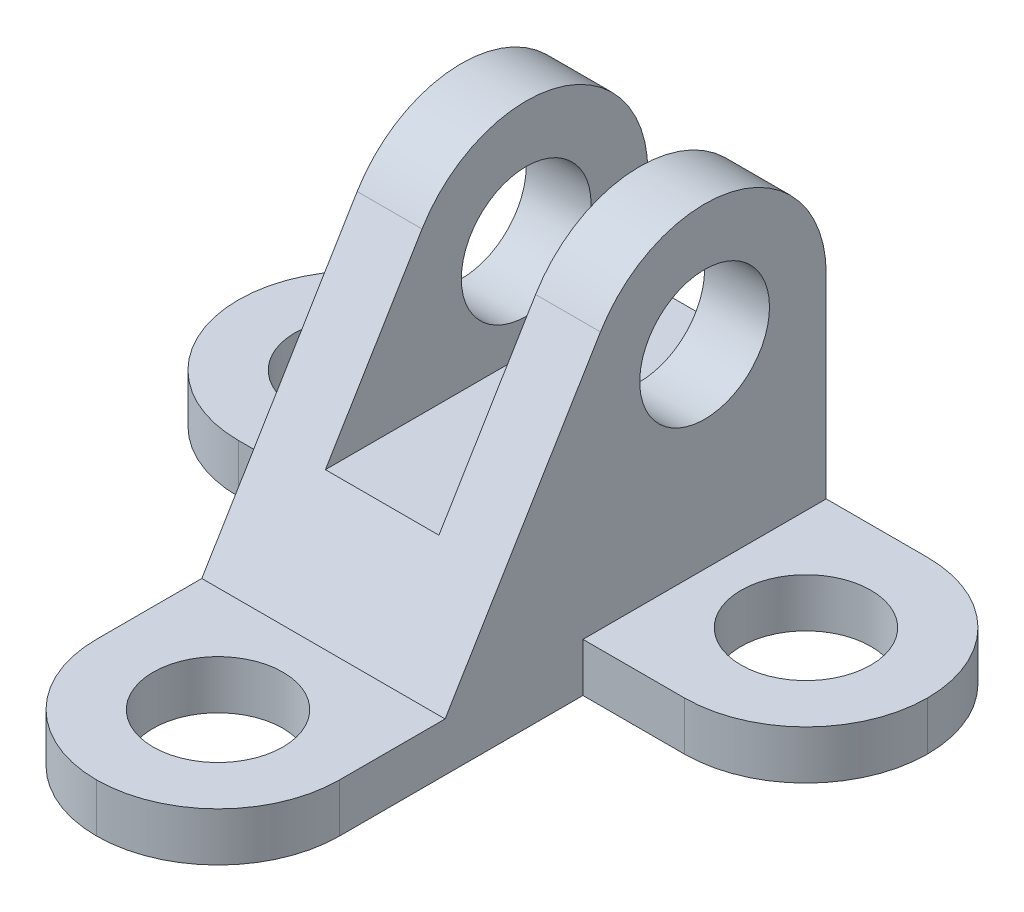
ISO-10303-21;
HEADER;
FILE_DESCRIPTION(('STEP AP214'),'2;1');
FILE_NAME('part.step','',(''),(''),'','','');
FILE_SCHEMA(('AUTOMOTIVE_DESIGN { 1 0 10303 214 1 1 1 1 }'));
ENDSEC;
DATA;
#1=APPLICATION_CONTEXT('core data for automotive mechanical design processes');
#2=APPLICATION_PROTOCOL_DEFINITION('international standard','automotive_design',2000,#1);
#3=PRODUCT_CONTEXT('',#1,'mechanical');
#4=PRODUCT('Part','Part','',(#3));
#5=PRODUCT_RELATED_PRODUCT_CATEGORY('part','',(#4));
#6=PRODUCT_DEFINITION_FORMATION('','',#4);
#7=PRODUCT_DEFINITION_CONTEXT('part definition',#1,'design');
#8=PRODUCT_DEFINITION('design','',#6,#7);
#9=PRODUCT_DEFINITION_SHAPE('','',#8);
#10=(LENGTH_UNIT() NAMED_UNIT(*) SI_UNIT(.MILLI.,.METRE.));
#11=(NAMED_UNIT(*) PLANE_ANGLE_UNIT() SI_UNIT($,.RADIAN.));
#12=(NAMED_UNIT(*) SI_UNIT($,.STERADIAN.) SOLID_ANGLE_UNIT());
#13=UNCERTAINTY_MEASURE_WITH_UNIT(LENGTH_MEASURE(1.E-05),#10,'distance_accuracy_value','');
#14=(GEOMETRIC_REPRESENTATION_CONTEXT(3) GLOBAL_UNCERTAINTY_ASSIGNED_CONTEXT((#13)) GLOBAL_UNIT_ASSIGNED_CONTEXT((#10,
#11,#12)) REPRESENTATION_CONTEXT('',''));
#15=CARTESIAN_POINT('',(0.,0.,0.));
#16=DIRECTION('',(0.,0.,1.));
#17=DIRECTION('',(1.,0.,0.));
#18=AXIS2_PLACEMENT_3D('',#15,#16,#17);
#19=CARTESIAN_POINT('',(0.,0.,0.));
#20=DIRECTION('',(0.,1.,0.));
#21=DIRECTION('',(0.,0.,1.));
#22=AXIS2_PLACEMENT_3D('',#19,#20,#21);
#23=PLANE('',#22);
#24=CARTESIAN_POINT('',(15.,0.,-15.));
#25=DIRECTION('',(0.,-1.,0.));
#26=DIRECTION('',(0.,0.,-1.));
#27=AXIS2_PLACEMENT_3D('',#24,#25,#26);
#28=CIRCLE('',#27,7.99999999999999);
#29=CARTESIAN_POINT('',(15.,0.,-23.));
#30=VERTEX_POINT('',#29);
#31=EDGE_CURVE('E543',#30,#30,#28,.T.);
#32=ORIENTED_EDGE('',*,*,#31,.F.);
#33=EDGE_LOOP('',(#32));
#34=FACE_BOUND('',#33,.T.);
#35=DIRECTION('',(1.,0.,0.));
#36=VECTOR('',#35,1.);
#37=CARTESIAN_POINT('',(0.,0.,-30.));
#38=LINE('',#37,#36);
#39=CARTESIAN_POINT('',(15.,0.,-30.));
#40=VERTEX_POINT('',#39);
#41=CARTESIAN_POINT('',(70.,0.,-30.));
#42=VERTEX_POINT('',#41);
#43=EDGE_CURVE('E301',#40,#42,#38,.T.);
#44=ORIENTED_EDGE('',*,*,#43,.T.);
#45=CARTESIAN_POINT('',(70.,0.,-15.));
#46=DIRECTION('',(0.,1.,0.));
#47=DIRECTION('',(0.,0.,1.));
#48=AXIS2_PLACEMENT_3D('',#45,#46,#47);
#49=CIRCLE('',#48,15.);
#50=CARTESIAN_POINT('',(85.,0.,-15.));
#51=VERTEX_POINT('',#50);
#52=EDGE_CURVE('E340',#42,#51,#49,.F.);
#53=ORIENTED_EDGE('',*,*,#52,.T.);
#54=CARTESIAN_POINT('',(70.,0.,-15.));
#55=DIRECTION('',(0.,1.,0.));
#56=DIRECTION('',(0.,0.,1.));
#57=AXIS2_PLACEMENT_3D('',#54,#55,#56);
#58=CIRCLE('',#57,15.);
#59=CARTESIAN_POINT('',(70.,0.,0.));
#60=VERTEX_POINT('',#59);
#61=EDGE_CURVE('E337',#51,#60,#58,.F.);
#62=ORIENTED_EDGE('',*,*,#61,.T.);
#63=DIRECTION('',(1.,0.,0.));
#64=VECTOR('',#63,1.);
#65=CARTESIAN_POINT('',(0.,0.,0.));
#66=LINE('',#65,#64);
#67=CARTESIAN_POINT('',(57.5,0.,0.));
#68=VERTEX_POINT('',#67);
#69=EDGE_CURVE('E296',#68,#60,#66,.T.);
#70=ORIENTED_EDGE('',*,*,#69,.F.);
#71=DIRECTION('',(0.,0.,1.));
#72=VECTOR('',#71,1.);
#73=CARTESIAN_POINT('',(57.5,0.,0.));
#74=LINE('',#73,#72);
#75=CARTESIAN_POINT('',(57.5,0.,30.));
#76=VERTEX_POINT('',#75);
#77=EDGE_CURVE('E292',#68,#76,#74,.T.);
#78=ORIENTED_EDGE('',*,*,#77,.T.);
#79=CARTESIAN_POINT('',(42.5,0.,30.));
#80=DIRECTION('',(0.,1.,0.));
#81=DIRECTION('',(0.,0.,1.));
#82=AXIS2_PLACEMENT_3D('',#79,#80,#81);
#83=CIRCLE('',#82,15.);
#84=CARTESIAN_POINT('',(42.5,0.,45.));
#85=VERTEX_POINT('',#84);
#86=EDGE_CURVE('E325',#76,#85,#83,.F.);
#87=ORIENTED_EDGE('',*,*,#86,.T.);
#88=CARTESIAN_POINT('',(42.5,0.,30.));
#89=DIRECTION('',(0.,1.,0.));
#90=DIRECTION('',(0.,0.,1.));
#91=AXIS2_PLACEMENT_3D('',#88,#89,#90);
#92=CIRCLE('',#91,15.);
#93=CARTESIAN_POINT('',(27.5,0.,30.));
#94=VERTEX_POINT('',#93);
#95=EDGE_CURVE('E328',#85,#94,#92,.F.);
#96=ORIENTED_EDGE('',*,*,#95,.T.);
#97=DIRECTION('',(0.,0.,1.));
#98=VECTOR('',#97,1.);
#99=CARTESIAN_POINT('',(27.5,0.,0.));
#100=LINE('',#99,#98);
#101=CARTESIAN_POINT('',(27.5,0.,0.));
#102=VERTEX_POINT('',#101);
#103=EDGE_CURVE('E275',#102,#94,#100,.T.);
#104=ORIENTED_EDGE('',*,*,#103,.F.);
#105=DIRECTION('',(1.,0.,0.));
#106=VECTOR('',#105,1.);
#107=CARTESIAN_POINT('',(0.,0.,0.));
#108=LINE('',#107,#106);
#109=CARTESIAN_POINT('',(15.,0.,0.));
#110=VERTEX_POINT('',#109);
#111=EDGE_CURVE('E305',#110,#102,#108,.T.);
#112=ORIENTED_EDGE('',*,*,#111,.F.);
#113=CARTESIAN_POINT('',(15.,0.,-15.));
#114=DIRECTION('',(0.,1.,0.));
#115=DIRECTION('',(0.,0.,1.));
#116=AXIS2_PLACEMENT_3D('',#113,#114,#115);
#117=CIRCLE('',#116,15.);
#118=CARTESIAN_POINT('',(0.,0.,-15.));
#119=VERTEX_POINT('',#118);
#120=EDGE_CURVE('E331',#110,#119,#117,.F.);
#121=ORIENTED_EDGE('',*,*,#120,.T.);
#122=CARTESIAN_POINT('',(15.,0.,-15.));
#123=DIRECTION('',(0.,1.,0.));
#124=DIRECTION('',(0.,0.,1.));
#125=AXIS2_PLACEMENT_3D('',#122,#123,#124);
#126=CIRCLE('',#125,15.);
#127=EDGE_CURVE('E334',#119,#40,#126,.F.);
#128=ORIENTED_EDGE('',*,*,#127,.T.);
#129=EDGE_LOOP('',(#44,#53,#62,#70,#78,#87,#96,#104,#112,#121,#128));
#130=FACE_BOUND('',#129,.T.);
#131=CARTESIAN_POINT('',(42.5,0.,30.));
#132=DIRECTION('',(0.,-1.,0.));
#133=DIRECTION('',(0.,0.,-1.));
#134=AXIS2_PLACEMENT_3D('',#131,#132,#133);
#135=CIRCLE('',#134,7.99999999999999);
#136=CARTESIAN_POINT('',(42.5,0.,22.));
#137=VERTEX_POINT('',#136);
#138=EDGE_CURVE('E526',#137,#137,#135,.T.);
#139=ORIENTED_EDGE('',*,*,#138,.F.);
#140=EDGE_LOOP('',(#139));
#141=FACE_BOUND('',#140,.T.);
#142=CARTESIAN_POINT('',(70.,0.,-15.));
#143=DIRECTION('',(0.,-1.,0.));
#144=DIRECTION('',(0.,0.,-1.));
#145=AXIS2_PLACEMENT_3D('',#142,#143,#144);
#146=CIRCLE('',#145,7.99999999999999);
#147=CARTESIAN_POINT('',(70.,0.,-23.));
#148=VERTEX_POINT('',#147);
#149=EDGE_CURVE('E535',#148,#148,#146,.T.);
#150=ORIENTED_EDGE('',*,*,#149,.F.);
#151=EDGE_LOOP('',(#150));
#152=FACE_BOUND('',#151,.T.);
#153=ADVANCED_FACE('F41',(#34,#130,#141,#152),#23,.F.);
#154=CARTESIAN_POINT('',(27.5,30.,-15.));
#155=DIRECTION('',(1.,0.,0.));
#156=DIRECTION('',(0.,0.,-1.));
#157=AXIS2_PLACEMENT_3D('',#154,#155,#156);
#158=CYLINDRICAL_SURFACE('',#157,15.);
#159=CARTESIAN_POINT('',(49.5,30.,-15.));
#160=DIRECTION('',(1.,0.,0.));
#161=DIRECTION('',(0.,0.,-1.));
#162=AXIS2_PLACEMENT_3D('',#159,#160,#161);
#163=CIRCLE('',#162,15.);
#164=CARTESIAN_POINT('',(49.5,37.7492977306435,-2.15677670201737));
#165=VERTEX_POINT('',#164);
#166=CARTESIAN_POINT('',(49.5,30.,-30.));
#167=VERTEX_POINT('',#166);
#168=EDGE_CURVE('E193',#165,#167,#163,.F.);
#169=ORIENTED_EDGE('',*,*,#168,.F.);
#170=DIRECTION('',(1.,0.,0.));
#171=VECTOR('',#170,1.);
#172=CARTESIAN_POINT('',(27.5,37.7492977306435,-2.15677670201736));
#173=LINE('',#172,#171);
#174=CARTESIAN_POINT('',(57.5,37.7492977306435,-2.15677670201737));
#175=VERTEX_POINT('',#174);
#176=EDGE_CURVE('E264',#165,#175,#173,.T.);
#177=ORIENTED_EDGE('',*,*,#176,.T.);
#178=CARTESIAN_POINT('',(57.5,30.,-15.));
#179=DIRECTION('',(1.,0.,0.));
#180=DIRECTION('',(0.,0.,-1.));
#181=AXIS2_PLACEMENT_3D('',#178,#179,#180);
#182=CIRCLE('',#181,15.);
#183=CARTESIAN_POINT('',(57.5,30.,-30.));
#184=VERTEX_POINT('',#183);
#185=EDGE_CURVE('E235',#184,#175,#182,.T.);
#186=ORIENTED_EDGE('',*,*,#185,.F.);
#187=DIRECTION('',(1.,0.,0.));
#188=VECTOR('',#187,1.);
#189=CARTESIAN_POINT('',(27.5,30.,-30.));
#190=LINE('',#189,#188);
#191=EDGE_CURVE('E268',#167,#184,#190,.T.);
#192=ORIENTED_EDGE('',*,*,#191,.F.);
#193=EDGE_LOOP('',(#169,#177,#186,#192));
#194=FACE_BOUND('',#193,.T.);
#195=ADVANCED_FACE('F406',(#194),#158,.T.);
#196=CARTESIAN_POINT('',(57.5,30.,-15.));
#197=DIRECTION('',(1.,0.,0.));
#198=DIRECTION('',(0.,0.,-1.));
#199=AXIS2_PLACEMENT_3D('',#196,#197,#198);
#200=CYLINDRICAL_SURFACE('',#199,7.99999999999999);
#201=CARTESIAN_POINT('',(49.5,30.,-15.));
#202=DIRECTION('',(1.,0.,0.));
#203=DIRECTION('',(0.,0.,-1.));
#204=AXIS2_PLACEMENT_3D('',#201,#202,#203);
#205=CIRCLE('',#204,7.99999999999999);
#206=CARTESIAN_POINT('',(49.5,30.,-23.));
#207=VERTEX_POINT('',#206);
#208=EDGE_CURVE('E217',#207,#207,#205,.F.);
#209=ORIENTED_EDGE('',*,*,#208,.T.);
#210=EDGE_LOOP('',(#209));
#211=FACE_BOUND('',#210,.T.);
#212=CARTESIAN_POINT('',(57.5,30.,-15.));
#213=DIRECTION('',(1.,0.,0.));
#214=DIRECTION('',(0.,0.,-1.));
#215=AXIS2_PLACEMENT_3D('',#212,#213,#214);
#216=CIRCLE('',#215,7.99999999999999);
#217=CARTESIAN_POINT('',(57.5,30.,-23.));
#218=VERTEX_POINT('',#217);
#219=EDGE_CURVE('E223',#218,#218,#216,.T.);
#220=ORIENTED_EDGE('',*,*,#219,.T.);
#221=EDGE_LOOP('',(#220));
#222=FACE_BOUND('',#221,.T.);
#223=ADVANCED_FACE('F389',(#211,#222),#200,.F.);
#224=CARTESIAN_POINT('',(0.,6.,0.));
#225=DIRECTION('',(0.,1.,0.));
#226=DIRECTION('',(0.,0.,1.));
#227=AXIS2_PLACEMENT_3D('',#224,#225,#226);
#228=PLANE('',#227);
#229=CARTESIAN_POINT('',(70.,6.,-15.));
#230=DIRECTION('',(0.,1.,0.));
#231=DIRECTION('',(0.,0.,1.));
#232=AXIS2_PLACEMENT_3D('',#229,#230,#231);
#233=CIRCLE('',#232,7.99999999999999);
#234=CARTESIAN_POINT('',(70.,6.,-7.00000000000001));
#235=VERTEX_POINT('',#234);
#236=EDGE_CURVE('E529',#235,#235,#233,.T.);
#237=ORIENTED_EDGE('',*,*,#236,.F.);
#238=EDGE_LOOP('',(#237));
#239=FACE_BOUND('',#238,.T.);
#240=DIRECTION('',(0.,0.,-1.));
#241=VECTOR('',#240,1.);
#242=CARTESIAN_POINT('',(57.5,6.,17.));
#243=LINE('',#242,#241);
#244=CARTESIAN_POINT('',(57.5,6.,0.));
#245=VERTEX_POINT('',#244);
#246=CARTESIAN_POINT('',(57.5,6.,-30.));
#247=VERTEX_POINT('',#246);
#248=EDGE_CURVE('E50',#245,#247,#243,.T.);
#249=ORIENTED_EDGE('',*,*,#248,.F.);
#250=DIRECTION('',(1.,0.,0.));
#251=VECTOR('',#250,1.);
#252=CARTESIAN_POINT('',(0.,6.,0.));
#253=LINE('',#252,#251);
#254=CARTESIAN_POINT('',(70.,6.,0.));
#255=VERTEX_POINT('',#254);
#256=EDGE_CURVE('E274',#245,#255,#253,.T.);
#257=ORIENTED_EDGE('',*,*,#256,.T.);
#258=CARTESIAN_POINT('',(70.,6.,-15.));
#259=DIRECTION('',(0.,1.,0.));
#260=DIRECTION('',(0.,0.,1.));
#261=AXIS2_PLACEMENT_3D('',#258,#259,#260);
#262=CIRCLE('',#261,15.);
#263=CARTESIAN_POINT('',(85.,6.,-15.));
#264=VERTEX_POINT('',#263);
#265=EDGE_CURVE('E354',#255,#264,#262,.T.);
#266=ORIENTED_EDGE('',*,*,#265,.T.);
#267=CARTESIAN_POINT('',(70.,6.,-15.));
#268=DIRECTION('',(0.,1.,0.));
#269=DIRECTION('',(0.,0.,1.));
#270=AXIS2_PLACEMENT_3D('',#267,#268,#269);
#271=CIRCLE('',#270,15.);
#272=CARTESIAN_POINT('',(70.,6.,-30.));
#273=VERTEX_POINT('',#272);
#274=EDGE_CURVE('E357',#264,#273,#271,.T.);
#275=ORIENTED_EDGE('',*,*,#274,.T.);
#276=DIRECTION('',(1.,0.,0.));
#277=VECTOR('',#276,1.);
#278=CARTESIAN_POINT('',(0.,6.,-30.));
#279=LINE('',#278,#277);
#280=EDGE_CURVE('E279',#247,#273,#279,.T.);
#281=ORIENTED_EDGE('',*,*,#280,.F.);
#282=EDGE_LOOP('',(#249,#257,#266,#275,#281));
#283=FACE_BOUND('',#282,.T.);
#284=ADVANCED_FACE('F506',(#239,#283),#228,.T.);
#285=CARTESIAN_POINT('',(15.,6.,-15.));
#286=DIRECTION('',(0.,1.,0.));
#287=DIRECTION('',(0.,0.,1.));
#288=AXIS2_PLACEMENT_3D('',#285,#286,#287);
#289=CIRCLE('',#288,7.99999999999999);
#290=CARTESIAN_POINT('',(15.,6.,-7.00000000000001));
#291=VERTEX_POINT('',#290);
#292=EDGE_CURVE('E539',#291,#291,#289,.T.);
#293=ORIENTED_EDGE('',*,*,#292,.F.);
#294=EDGE_LOOP('',(#293));
#295=FACE_BOUND('',#294,.T.);
#296=DIRECTION('',(1.,0.,0.));
#297=VECTOR('',#296,1.);
#298=CARTESIAN_POINT('',(0.,6.,0.));
#299=LINE('',#298,#297);
#300=CARTESIAN_POINT('',(15.,6.,0.));
#301=VERTEX_POINT('',#300);
#302=CARTESIAN_POINT('',(27.5,6.,0.));
#303=VERTEX_POINT('',#302);
#304=EDGE_CURVE('E284',#301,#303,#299,.T.);
#305=ORIENTED_EDGE('',*,*,#304,.T.);
#306=DIRECTION('',(0.,0.,-1.));
#307=VECTOR('',#306,1.);
#308=CARTESIAN_POINT('',(27.5,6.,17.));
#309=LINE('',#308,#307);
#310=CARTESIAN_POINT('',(27.5,6.,-30.));
#311=VERTEX_POINT('',#310);
#312=EDGE_CURVE('E236',#303,#311,#309,.T.);
#313=ORIENTED_EDGE('',*,*,#312,.T.);
#314=CARTESIAN_POINT('',(15.,6.,-30.));
#315=VERTEX_POINT('',#314);
#316=EDGE_CURVE('E280',#315,#311,#279,.T.);
#317=ORIENTED_EDGE('',*,*,#316,.F.);
#318=CARTESIAN_POINT('',(15.,6.,-15.));
#319=DIRECTION('',(0.,1.,0.));
#320=DIRECTION('',(0.,0.,1.));
#321=AXIS2_PLACEMENT_3D('',#318,#319,#320);
#322=CIRCLE('',#321,15.);
#323=CARTESIAN_POINT('',(0.,6.,-15.));
#324=VERTEX_POINT('',#323);
#325=EDGE_CURVE('E351',#315,#324,#322,.T.);
#326=ORIENTED_EDGE('',*,*,#325,.T.);
#327=CARTESIAN_POINT('',(15.,6.,-15.));
#328=DIRECTION('',(0.,1.,0.));
#329=DIRECTION('',(0.,0.,1.));
#330=AXIS2_PLACEMENT_3D('',#327,#328,#329);
#331=CIRCLE('',#330,15.);
#332=EDGE_CURVE('E348',#324,#301,#331,.T.);
#333=ORIENTED_EDGE('',*,*,#332,.T.);
#334=EDGE_LOOP('',(#305,#313,#317,#326,#333));
#335=FACE_BOUND('',#334,.T.);
#336=ADVANCED_FACE('F437',(#295,#335),#228,.T.);
#337=CARTESIAN_POINT('',(57.5,6.,0.));
#338=DIRECTION('',(1.,0.,0.));
#339=DIRECTION('',(0.,0.,-1.));
#340=AXIS2_PLACEMENT_3D('',#337,#338,#339);
#341=PLANE('',#340);
#342=ORIENTED_EDGE('',*,*,#219,.F.);
#343=EDGE_LOOP('',(#342));
#344=FACE_BOUND('',#343,.T.);
#345=DIRECTION('',(0.,-1.,0.));
#346=VECTOR('',#345,1.);
#347=CARTESIAN_POINT('',(57.5,6.,0.));
#348=LINE('',#347,#346);
#349=EDGE_CURVE('E314',#245,#68,#348,.T.);
#350=ORIENTED_EDGE('',*,*,#349,.F.);
#351=ORIENTED_EDGE('',*,*,#248,.T.);
#352=DIRECTION('',(0.,1.,0.));
#353=VECTOR('',#352,1.);
#354=CARTESIAN_POINT('',(57.5,6.,-30.));
#355=LINE('',#354,#353);
#356=EDGE_CURVE('E250',#247,#184,#355,.T.);
#357=ORIENTED_EDGE('',*,*,#356,.T.);
#358=ORIENTED_EDGE('',*,*,#185,.T.);
#359=DIRECTION('',(0.,-0.856214886532175,0.516619848709566));
#360=VECTOR('',#359,1.);
#361=CARTESIAN_POINT('',(57.5,37.7492977306435,-2.15677670201737));
#362=LINE('',#361,#360);
#363=CARTESIAN_POINT('',(57.5,6.,17.));
#364=VERTEX_POINT('',#363);
#365=EDGE_CURVE('E231',#175,#364,#362,.T.);
#366=ORIENTED_EDGE('',*,*,#365,.T.);
#367=DIRECTION('',(0.,0.,1.));
#368=VECTOR('',#367,1.);
#369=CARTESIAN_POINT('',(57.5,6.,0.));
#370=LINE('',#369,#368);
#371=CARTESIAN_POINT('',(57.5,6.,30.));
#372=VERTEX_POINT('',#371);
#373=EDGE_CURVE('E271',#364,#372,#370,.T.);
#374=ORIENTED_EDGE('',*,*,#373,.T.);
#375=DIRECTION('',(0.,-1.,0.));
#376=VECTOR('',#375,1.);
#377=CARTESIAN_POINT('',(57.5,0.,30.));
#378=LINE('',#377,#376);
#379=EDGE_CURVE('E239',#372,#76,#378,.T.);
#380=ORIENTED_EDGE('',*,*,#379,.T.);
#381=ORIENTED_EDGE('',*,*,#77,.F.);
#382=EDGE_LOOP('',(#350,#351,#357,#358,#366,#374,#380,#381));
#383=FACE_BOUND('',#382,.T.);
#384=ADVANCED_FACE('F433',(#344,#383),#341,.T.);
#385=CARTESIAN_POINT('',(0.,6.,0.));
#386=DIRECTION('',(0.,0.,-1.));
#387=DIRECTION('',(-1.,0.,0.));
#388=AXIS2_PLACEMENT_3D('',#385,#386,#387);
#389=PLANE('',#388);
#390=ORIENTED_EDGE('',*,*,#69,.T.);
#391=DIRECTION('',(0.,-1.,0.));
#392=VECTOR('',#391,1.);
#393=CARTESIAN_POINT('',(70.,6.,0.));
#394=LINE('',#393,#392);
#395=EDGE_CURVE('E361',#60,#255,#394,.F.);
#396=ORIENTED_EDGE('',*,*,#395,.T.);
#397=ORIENTED_EDGE('',*,*,#256,.F.);
#398=ORIENTED_EDGE('',*,*,#349,.T.);
#399=EDGE_LOOP('',(#390,#396,#397,#398));
#400=FACE_BOUND('',#399,.T.);
#401=ADVANCED_FACE('F430',(#400),#389,.F.);
#402=CARTESIAN_POINT('',(0.,6.,-30.));
#403=DIRECTION('',(0.,0.,-1.));
#404=DIRECTION('',(-1.,0.,0.));
#405=AXIS2_PLACEMENT_3D('',#402,#403,#404);
#406=PLANE('',#405);
#407=DIRECTION('',(0.,-1.,0.));
#408=VECTOR('',#407,1.);
#409=CARTESIAN_POINT('',(49.5,18.,-30.));
#410=LINE('',#409,#408);
#411=CARTESIAN_POINT('',(49.5,18.,-30.));
#412=VERTEX_POINT('',#411);
#413=EDGE_CURVE('E189',#167,#412,#410,.T.);
#414=ORIENTED_EDGE('',*,*,#413,.F.);
#415=ORIENTED_EDGE('',*,*,#191,.T.);
#416=ORIENTED_EDGE('',*,*,#356,.F.);
#417=ORIENTED_EDGE('',*,*,#280,.T.);
#418=DIRECTION('',(0.,-1.,0.));
#419=VECTOR('',#418,1.);
#420=CARTESIAN_POINT('',(70.,0.,-30.));
#421=LINE('',#420,#419);
#422=EDGE_CURVE('E321',#273,#42,#421,.T.);
#423=ORIENTED_EDGE('',*,*,#422,.T.);
#424=ORIENTED_EDGE('',*,*,#43,.F.);
#425=DIRECTION('',(0.,-1.,0.));
#426=VECTOR('',#425,1.);
#427=CARTESIAN_POINT('',(15.,6.,-30.));
#428=LINE('',#427,#426);
#429=EDGE_CURVE('E317',#40,#315,#428,.F.);
#430=ORIENTED_EDGE('',*,*,#429,.T.);
#431=ORIENTED_EDGE('',*,*,#316,.T.);
#432=DIRECTION('',(0.,1.,0.));
#433=VECTOR('',#432,1.);
#434=CARTESIAN_POINT('',(27.5,6.,-30.));
#435=LINE('',#434,#433);
#436=CARTESIAN_POINT('',(27.5,30.,-30.));
#437=VERTEX_POINT('',#436);
#438=EDGE_CURVE('E57',#311,#437,#435,.T.);
#439=ORIENTED_EDGE('',*,*,#438,.T.);
#440=CARTESIAN_POINT('',(35.5,30.,-30.));
#441=VERTEX_POINT('',#440);
#442=EDGE_CURVE('E265',#437,#441,#190,.T.);
#443=ORIENTED_EDGE('',*,*,#442,.T.);
#444=DIRECTION('',(0.,1.,0.));
#445=VECTOR('',#444,1.);
#446=CARTESIAN_POINT('',(35.5,18.,-30.));
#447=LINE('',#446,#445);
#448=CARTESIAN_POINT('',(35.5,18.,-30.));
#449=VERTEX_POINT('',#448);
#450=EDGE_CURVE('E186',#449,#441,#447,.T.);
#451=ORIENTED_EDGE('',*,*,#450,.F.);
#452=DIRECTION('',(-1.,0.,0.));
#453=VECTOR('',#452,1.);
#454=CARTESIAN_POINT('',(49.5,18.,-30.));
#455=LINE('',#454,#453);
#456=EDGE_CURVE('E179',#412,#449,#455,.T.);
#457=ORIENTED_EDGE('',*,*,#456,.F.);
#458=EDGE_LOOP('',(#414,#415,#416,#417,#423,#424,#430,#431,#439,#443,#451,#457));
#459=FACE_BOUND('',#458,.T.);
#460=ADVANCED_FACE('F199',(#459),#406,.T.);
#461=CARTESIAN_POINT('',(0.,6.,0.));
#462=DIRECTION('',(0.,0.,-1.));
#463=DIRECTION('',(-1.,0.,0.));
#464=AXIS2_PLACEMENT_3D('',#461,#462,#463);
#465=PLANE('',#464);
#466=ORIENTED_EDGE('',*,*,#304,.F.);
#467=DIRECTION('',(0.,-1.,0.));
#468=VECTOR('',#467,1.);
#469=CARTESIAN_POINT('',(15.,0.,0.));
#470=LINE('',#469,#468);
#471=EDGE_CURVE('E364',#301,#110,#470,.T.);
#472=ORIENTED_EDGE('',*,*,#471,.T.);
#473=ORIENTED_EDGE('',*,*,#111,.T.);
#474=DIRECTION('',(0.,-1.,0.));
#475=VECTOR('',#474,1.);
#476=CARTESIAN_POINT('',(27.5,6.,0.));
#477=LINE('',#476,#475);
#478=EDGE_CURVE('E291',#303,#102,#477,.T.);
#479=ORIENTED_EDGE('',*,*,#478,.F.);
#480=EDGE_LOOP('',(#466,#472,#473,#479));
#481=FACE_BOUND('',#480,.T.);
#482=ADVANCED_FACE('F423',(#481),#465,.F.);
#483=CARTESIAN_POINT('',(27.5,6.,0.));
#484=DIRECTION('',(1.,0.,0.));
#485=DIRECTION('',(0.,0.,-1.));
#486=AXIS2_PLACEMENT_3D('',#483,#484,#485);
#487=PLANE('',#486);
#488=CARTESIAN_POINT('',(27.5,30.,-15.));
#489=DIRECTION('',(1.,0.,0.));
#490=DIRECTION('',(0.,0.,-1.));
#491=AXIS2_PLACEMENT_3D('',#488,#489,#490);
#492=CIRCLE('',#491,7.99999999999999);
#493=CARTESIAN_POINT('',(27.5,30.,-23.));
#494=VERTEX_POINT('',#493);
#495=EDGE_CURVE('E227',#494,#494,#492,.T.);
#496=ORIENTED_EDGE('',*,*,#495,.T.);
#497=EDGE_LOOP('',(#496));
#498=FACE_BOUND('',#497,.T.);
#499=ORIENTED_EDGE('',*,*,#103,.T.);
#500=DIRECTION('',(0.,-1.,0.));
#501=VECTOR('',#500,1.);
#502=CARTESIAN_POINT('',(27.5,6.,30.));
#503=LINE('',#502,#501);
#504=CARTESIAN_POINT('',(27.5,6.,30.));
#505=VERTEX_POINT('',#504);
#506=EDGE_CURVE('E367',#94,#505,#503,.F.);
#507=ORIENTED_EDGE('',*,*,#506,.T.);
#508=DIRECTION('',(0.,0.,1.));
#509=VECTOR('',#508,1.);
#510=CARTESIAN_POINT('',(27.5,6.,0.));
#511=LINE('',#510,#509);
#512=CARTESIAN_POINT('',(27.5,6.,17.));
#513=VERTEX_POINT('',#512);
#514=EDGE_CURVE('E288',#513,#505,#511,.T.);
#515=ORIENTED_EDGE('',*,*,#514,.F.);
#516=DIRECTION('',(0.,-0.856214886532175,0.516619848709566));
#517=VECTOR('',#516,1.);
#518=CARTESIAN_POINT('',(27.5,37.7492977306435,-2.15677670201737));
#519=LINE('',#518,#517);
#520=CARTESIAN_POINT('',(27.5,37.7492977306435,-2.15677670201736));
#521=VERTEX_POINT('',#520);
#522=EDGE_CURVE('E232',#521,#513,#519,.T.);
#523=ORIENTED_EDGE('',*,*,#522,.F.);
#524=CARTESIAN_POINT('',(27.5,30.,-15.));
#525=DIRECTION('',(1.,0.,0.));
#526=DIRECTION('',(0.,0.,-1.));
#527=AXIS2_PLACEMENT_3D('',#524,#525,#526);
#528=CIRCLE('',#527,15.);
#529=EDGE_CURVE('E242',#437,#521,#528,.T.);
#530=ORIENTED_EDGE('',*,*,#529,.F.);
#531=ORIENTED_EDGE('',*,*,#438,.F.);
#532=ORIENTED_EDGE('',*,*,#312,.F.);
#533=ORIENTED_EDGE('',*,*,#478,.T.);
#534=EDGE_LOOP('',(#499,#507,#515,#523,#530,#531,#532,#533));
#535=FACE_BOUND('',#534,.T.);
#536=ADVANCED_FACE('F420',(#498,#535),#487,.F.);
#537=CARTESIAN_POINT('',(42.5,6.,30.));
#538=DIRECTION('',(0.,1.,0.));
#539=DIRECTION('',(0.,0.,1.));
#540=AXIS2_PLACEMENT_3D('',#537,#538,#539);
#541=CIRCLE('',#540,7.99999999999999);
#542=CARTESIAN_POINT('',(42.5,6.,38.));
#543=VERTEX_POINT('',#542);
#544=EDGE_CURVE('E197',#543,#543,#541,.T.);
#545=ORIENTED_EDGE('',*,*,#544,.F.);
#546=EDGE_LOOP('',(#545));
#547=FACE_BOUND('',#546,.T.);
#548=DIRECTION('',(1.,0.,0.));
#549=VECTOR('',#548,1.);
#550=CARTESIAN_POINT('',(27.5,6.,17.));
#551=LINE('',#550,#549);
#552=EDGE_CURVE('E246',#513,#364,#551,.T.);
#553=ORIENTED_EDGE('',*,*,#552,.F.);
#554=ORIENTED_EDGE('',*,*,#514,.T.);
#555=CARTESIAN_POINT('',(42.5,6.,30.));
#556=DIRECTION('',(0.,1.,0.));
#557=DIRECTION('',(0.,0.,1.));
#558=AXIS2_PLACEMENT_3D('',#555,#556,#557);
#559=CIRCLE('',#558,15.);
#560=CARTESIAN_POINT('',(42.5,6.,45.));
#561=VERTEX_POINT('',#560);
#562=EDGE_CURVE('E65',#505,#561,#559,.T.);
#563=ORIENTED_EDGE('',*,*,#562,.T.);
#564=CARTESIAN_POINT('',(42.5,6.,30.));
#565=DIRECTION('',(0.,1.,0.));
#566=DIRECTION('',(0.,0.,1.));
#567=AXIS2_PLACEMENT_3D('',#564,#565,#566);
#568=CIRCLE('',#567,15.);
#569=EDGE_CURVE('E343',#561,#372,#568,.T.);
#570=ORIENTED_EDGE('',*,*,#569,.T.);
#571=ORIENTED_EDGE('',*,*,#373,.F.);
#572=EDGE_LOOP('',(#553,#554,#563,#570,#571));
#573=FACE_BOUND('',#572,.T.);
#574=ADVANCED_FACE('F418',(#547,#573),#228,.T.);
#575=CARTESIAN_POINT('',(70.,6.,-15.));
#576=DIRECTION('',(0.,-1.,0.));
#577=DIRECTION('',(0.,0.,-1.));
#578=AXIS2_PLACEMENT_3D('',#575,#576,#577);
#579=CYLINDRICAL_SURFACE('',#578,15.);
#580=DIRECTION('',(0.,-1.,0.));
#581=VECTOR('',#580,1.);
#582=CARTESIAN_POINT('',(85.,6.,-15.));
#583=LINE('',#582,#581);
#584=EDGE_CURVE('E297',#264,#51,#583,.T.);
#585=ORIENTED_EDGE('',*,*,#584,.F.);
#586=ORIENTED_EDGE('',*,*,#265,.F.);
#587=ORIENTED_EDGE('',*,*,#395,.F.);
#588=ORIENTED_EDGE('',*,*,#61,.F.);
#589=EDGE_LOOP('',(#585,#586,#587,#588));
#590=FACE_BOUND('',#589,.T.);
#591=ADVANCED_FACE('F443',(#590),#579,.T.);
#592=CARTESIAN_POINT('',(70.,6.,-15.));
#593=DIRECTION('',(0.,1.,0.));
#594=DIRECTION('',(0.,0.,1.));
#595=AXIS2_PLACEMENT_3D('',#592,#593,#594);
#596=CYLINDRICAL_SURFACE('',#595,15.);
#597=ORIENTED_EDGE('',*,*,#274,.F.);
#598=ORIENTED_EDGE('',*,*,#584,.T.);
#599=ORIENTED_EDGE('',*,*,#52,.F.);
#600=ORIENTED_EDGE('',*,*,#422,.F.);
#601=EDGE_LOOP('',(#597,#598,#599,#600));
#602=FACE_BOUND('',#601,.T.);
#603=ADVANCED_FACE('F439',(#602),#596,.T.);
#604=CARTESIAN_POINT('',(15.,6.,-15.));
#605=DIRECTION('',(0.,1.,0.));
#606=DIRECTION('',(0.,0.,1.));
#607=AXIS2_PLACEMENT_3D('',#604,#605,#606);
#608=CYLINDRICAL_SURFACE('',#607,15.);
#609=ORIENTED_EDGE('',*,*,#471,.F.);
#610=ORIENTED_EDGE('',*,*,#332,.F.);
#611=DIRECTION('',(0.,-1.,0.));
#612=VECTOR('',#611,1.);
#613=CARTESIAN_POINT('',(0.,6.,-15.));
#614=LINE('',#613,#612);
#615=EDGE_CURVE('E376',#119,#324,#614,.F.);
#616=ORIENTED_EDGE('',*,*,#615,.F.);
#617=ORIENTED_EDGE('',*,*,#120,.F.);
#618=EDGE_LOOP('',(#609,#610,#616,#617));
#619=FACE_BOUND('',#618,.T.);
#620=ADVANCED_FACE('F442',(#619),#608,.T.);
#621=CARTESIAN_POINT('',(15.,6.,-15.));
#622=DIRECTION('',(0.,-1.,0.));
#623=DIRECTION('',(0.,0.,-1.));
#624=AXIS2_PLACEMENT_3D('',#621,#622,#623);
#625=CYLINDRICAL_SURFACE('',#624,15.);
#626=ORIENTED_EDGE('',*,*,#325,.F.);
#627=ORIENTED_EDGE('',*,*,#429,.F.);
#628=ORIENTED_EDGE('',*,*,#127,.F.);
#629=ORIENTED_EDGE('',*,*,#615,.T.);
#630=EDGE_LOOP('',(#626,#627,#628,#629));
#631=FACE_BOUND('',#630,.T.);
#632=ADVANCED_FACE('F448',(#631),#625,.T.);
#633=CARTESIAN_POINT('',(42.5,6.,30.));
#634=DIRECTION('',(0.,1.,0.));
#635=DIRECTION('',(0.,0.,1.));
#636=AXIS2_PLACEMENT_3D('',#633,#634,#635);
#637=CYLINDRICAL_SURFACE('',#636,15.);
#638=ORIENTED_EDGE('',*,*,#379,.F.);
#639=ORIENTED_EDGE('',*,*,#569,.F.);
#640=DIRECTION('',(0.,-1.,0.));
#641=VECTOR('',#640,1.);
#642=CARTESIAN_POINT('',(42.5,6.,45.));
#643=LINE('',#642,#641);
#644=EDGE_CURVE('E263',#85,#561,#643,.F.);
#645=ORIENTED_EDGE('',*,*,#644,.F.);
#646=ORIENTED_EDGE('',*,*,#86,.F.);
#647=EDGE_LOOP('',(#638,#639,#645,#646));
#648=FACE_BOUND('',#647,.T.);
#649=ADVANCED_FACE('F43',(#648),#637,.T.);
#650=CARTESIAN_POINT('',(42.5,6.,30.));
#651=DIRECTION('',(0.,-1.,0.));
#652=DIRECTION('',(0.,0.,-1.));
#653=AXIS2_PLACEMENT_3D('',#650,#651,#652);
#654=CYLINDRICAL_SURFACE('',#653,15.);
#655=ORIENTED_EDGE('',*,*,#562,.F.);
#656=ORIENTED_EDGE('',*,*,#506,.F.);
#657=ORIENTED_EDGE('',*,*,#95,.F.);
#658=ORIENTED_EDGE('',*,*,#644,.T.);
#659=EDGE_LOOP('',(#655,#656,#657,#658));
#660=FACE_BOUND('',#659,.T.);
#661=ADVANCED_FACE('F454',(#660),#654,.T.);
#662=CARTESIAN_POINT('',(27.5,37.7492977306435,-2.15677670201737));
#663=DIRECTION('',(0.,0.516619848709566,0.856214886532175));
#664=DIRECTION('',(0.,-0.856214886532175,0.516619848709566));
#665=AXIS2_PLACEMENT_3D('',#662,#663,#664);
#666=PLANE('',#665);
#667=DIRECTION('',(0.,0.856214886532175,-0.516619848709566));
#668=VECTOR('',#667,1.);
#669=CARTESIAN_POINT('',(49.5,37.7492977306435,-2.15677670201737));
#670=LINE('',#669,#668);
#671=CARTESIAN_POINT('',(49.5,18.,9.75948330024529));
#672=VERTEX_POINT('',#671);
#673=EDGE_CURVE('E220',#672,#165,#670,.T.);
#674=ORIENTED_EDGE('',*,*,#673,.F.);
#675=DIRECTION('',(1.,0.,0.));
#676=VECTOR('',#675,1.);
#677=CARTESIAN_POINT('',(27.5,18.,9.75948330024529));
#678=LINE('',#677,#676);
#679=CARTESIAN_POINT('',(35.5,18.,9.75948330024529));
#680=VERTEX_POINT('',#679);
#681=EDGE_CURVE('E11',#680,#672,#678,.T.);
#682=ORIENTED_EDGE('',*,*,#681,.F.);
#683=DIRECTION('',(0.,-0.856214886532175,0.516619848709566));
#684=VECTOR('',#683,1.);
#685=CARTESIAN_POINT('',(35.5,37.7492977306435,-2.15677670201737));
#686=LINE('',#685,#684);
#687=CARTESIAN_POINT('',(35.5,37.7492977306435,-2.15677670201737));
#688=VERTEX_POINT('',#687);
#689=EDGE_CURVE('E214',#688,#680,#686,.T.);
#690=ORIENTED_EDGE('',*,*,#689,.F.);
#691=EDGE_CURVE('E259',#521,#688,#173,.T.);
#692=ORIENTED_EDGE('',*,*,#691,.F.);
#693=ORIENTED_EDGE('',*,*,#522,.T.);
#694=ORIENTED_EDGE('',*,*,#552,.T.);
#695=ORIENTED_EDGE('',*,*,#365,.F.);
#696=ORIENTED_EDGE('',*,*,#176,.F.);
#697=EDGE_LOOP('',(#674,#682,#690,#692,#693,#694,#695,#696));
#698=FACE_BOUND('',#697,.T.);
#699=ADVANCED_FACE('F456',(#698),#666,.T.);
#700=CARTESIAN_POINT('',(35.5,30.,-15.));
#701=DIRECTION('',(-1.,0.,0.));
#702=DIRECTION('',(0.,0.,1.));
#703=AXIS2_PLACEMENT_3D('',#700,#701,#702);
#704=CIRCLE('',#703,15.);
#705=EDGE_CURVE('E211',#441,#688,#704,.F.);
#706=ORIENTED_EDGE('',*,*,#705,.F.);
#707=ORIENTED_EDGE('',*,*,#442,.F.);
#708=ORIENTED_EDGE('',*,*,#529,.T.);
#709=ORIENTED_EDGE('',*,*,#691,.T.);
#710=EDGE_LOOP('',(#706,#707,#708,#709));
#711=FACE_BOUND('',#710,.T.);
#712=ADVANCED_FACE('F401',(#711),#158,.T.);
#713=CARTESIAN_POINT('',(35.5,30.,-15.));
#714=DIRECTION('',(-1.,0.,0.));
#715=DIRECTION('',(0.,0.,1.));
#716=AXIS2_PLACEMENT_3D('',#713,#714,#715);
#717=CIRCLE('',#716,7.99999999999999);
#718=CARTESIAN_POINT('',(35.5,30.,-7.));
#719=VERTEX_POINT('',#718);
#720=EDGE_CURVE('E209',#719,#719,#717,.F.);
#721=ORIENTED_EDGE('',*,*,#720,.T.);
#722=EDGE_LOOP('',(#721));
#723=FACE_BOUND('',#722,.T.);
#724=ORIENTED_EDGE('',*,*,#495,.F.);
#725=EDGE_LOOP('',(#724));
#726=FACE_BOUND('',#725,.T.);
#727=ADVANCED_FACE('F393',(#723,#726),#200,.F.);
#728=CARTESIAN_POINT('',(49.5,18.,20.));
#729=DIRECTION('',(1.,0.,0.));
#730=DIRECTION('',(0.,0.,-1.));
#731=AXIS2_PLACEMENT_3D('',#728,#729,#730);
#732=PLANE('',#731);
#733=ORIENTED_EDGE('',*,*,#673,.T.);
#734=ORIENTED_EDGE('',*,*,#168,.T.);
#735=ORIENTED_EDGE('',*,*,#413,.T.);
#736=DIRECTION('',(0.,0.,-1.));
#737=VECTOR('',#736,1.);
#738=CARTESIAN_POINT('',(49.5,18.,20.));
#739=LINE('',#738,#737);
#740=EDGE_CURVE('E174',#672,#412,#739,.T.);
#741=ORIENTED_EDGE('',*,*,#740,.F.);
#742=EDGE_LOOP('',(#733,#734,#735,#741));
#743=FACE_BOUND('',#742,.T.);
#744=ORIENTED_EDGE('',*,*,#208,.F.);
#745=EDGE_LOOP('',(#744));
#746=FACE_BOUND('',#745,.T.);
#747=ADVANCED_FACE('F190',(#743,#746),#732,.F.);
#748=CARTESIAN_POINT('',(35.5,18.,20.));
#749=DIRECTION('',(-1.,0.,0.));
#750=DIRECTION('',(0.,0.,1.));
#751=AXIS2_PLACEMENT_3D('',#748,#749,#750);
#752=PLANE('',#751);
#753=ORIENTED_EDGE('',*,*,#689,.T.);
#754=DIRECTION('',(0.,0.,-1.));
#755=VECTOR('',#754,1.);
#756=CARTESIAN_POINT('',(35.5,18.,20.));
#757=LINE('',#756,#755);
#758=EDGE_CURVE('E185',#680,#449,#757,.T.);
#759=ORIENTED_EDGE('',*,*,#758,.T.);
#760=ORIENTED_EDGE('',*,*,#450,.T.);
#761=ORIENTED_EDGE('',*,*,#705,.T.);
#762=EDGE_LOOP('',(#753,#759,#760,#761));
#763=FACE_BOUND('',#762,.T.);
#764=ORIENTED_EDGE('',*,*,#720,.F.);
#765=EDGE_LOOP('',(#764));
#766=FACE_BOUND('',#765,.T.);
#767=ADVANCED_FACE('F392',(#763,#766),#752,.F.);
#768=CARTESIAN_POINT('',(49.5,18.,20.));
#769=DIRECTION('',(0.,-1.,0.));
#770=DIRECTION('',(0.,0.,-1.));
#771=AXIS2_PLACEMENT_3D('',#768,#769,#770);
#772=PLANE('',#771);
#773=ORIENTED_EDGE('',*,*,#681,.T.);
#774=ORIENTED_EDGE('',*,*,#740,.T.);
#775=ORIENTED_EDGE('',*,*,#456,.T.);
#776=ORIENTED_EDGE('',*,*,#758,.F.);
#777=EDGE_LOOP('',(#773,#774,#775,#776));
#778=FACE_BOUND('',#777,.T.);
#779=ADVANCED_FACE('F176',(#778),#772,.F.);
#780=CARTESIAN_POINT('',(42.5,0.,30.));
#781=DIRECTION('',(0.,-1.,0.));
#782=DIRECTION('',(0.,0.,-1.));
#783=AXIS2_PLACEMENT_3D('',#780,#781,#782);
#784=CYLINDRICAL_SURFACE('',#783,7.99999999999999);
#785=ORIENTED_EDGE('',*,*,#138,.T.);
#786=EDGE_LOOP('',(#785));
#787=FACE_BOUND('',#786,.T.);
#788=ORIENTED_EDGE('',*,*,#544,.T.);
#789=EDGE_LOOP('',(#788));
#790=FACE_BOUND('',#789,.T.);
#791=ADVANCED_FACE('F556',(#787,#790),#784,.F.);
#792=CARTESIAN_POINT('',(70.,0.,-15.));
#793=DIRECTION('',(0.,-1.,0.));
#794=DIRECTION('',(0.,0.,-1.));
#795=AXIS2_PLACEMENT_3D('',#792,#793,#794);
#796=CYLINDRICAL_SURFACE('',#795,7.99999999999999);
#797=ORIENTED_EDGE('',*,*,#149,.T.);
#798=EDGE_LOOP('',(#797));
#799=FACE_BOUND('',#798,.T.);
#800=ORIENTED_EDGE('',*,*,#236,.T.);
#801=EDGE_LOOP('',(#800));
#802=FACE_BOUND('',#801,.T.);
#803=ADVANCED_FACE('F550',(#799,#802),#796,.F.);
#804=CARTESIAN_POINT('',(15.,0.,-15.));
#805=DIRECTION('',(0.,-1.,0.));
#806=DIRECTION('',(0.,0.,-1.));
#807=AXIS2_PLACEMENT_3D('',#804,#805,#806);
#808=CYLINDRICAL_SURFACE('',#807,7.99999999999999);
#809=ORIENTED_EDGE('',*,*,#31,.T.);
#810=EDGE_LOOP('',(#809));
#811=FACE_BOUND('',#810,.T.);
#812=ORIENTED_EDGE('',*,*,#292,.T.);
#813=EDGE_LOOP('',(#812));
#814=FACE_BOUND('',#813,.T.);
#815=ADVANCED_FACE('F547',(#811,#814),#808,.F.);
#816=CLOSED_SHELL('',(#153,#195,#223,#284,#336,#384,#401,#460,#482,#536,#574,#591,#603,#620,
#632,#649,#661,#699,#712,#727,#747,#767,#779,#791,#803,#815));
#817=MANIFOLD_SOLID_BREP('B2',#816);
#818=ADVANCED_BREP_SHAPE_REPRESENTATION('',(#18,#817),#14);
#819=SHAPE_DEFINITION_REPRESENTATION(#9,#818);
ENDSEC;
END-ISO-10303-21;
